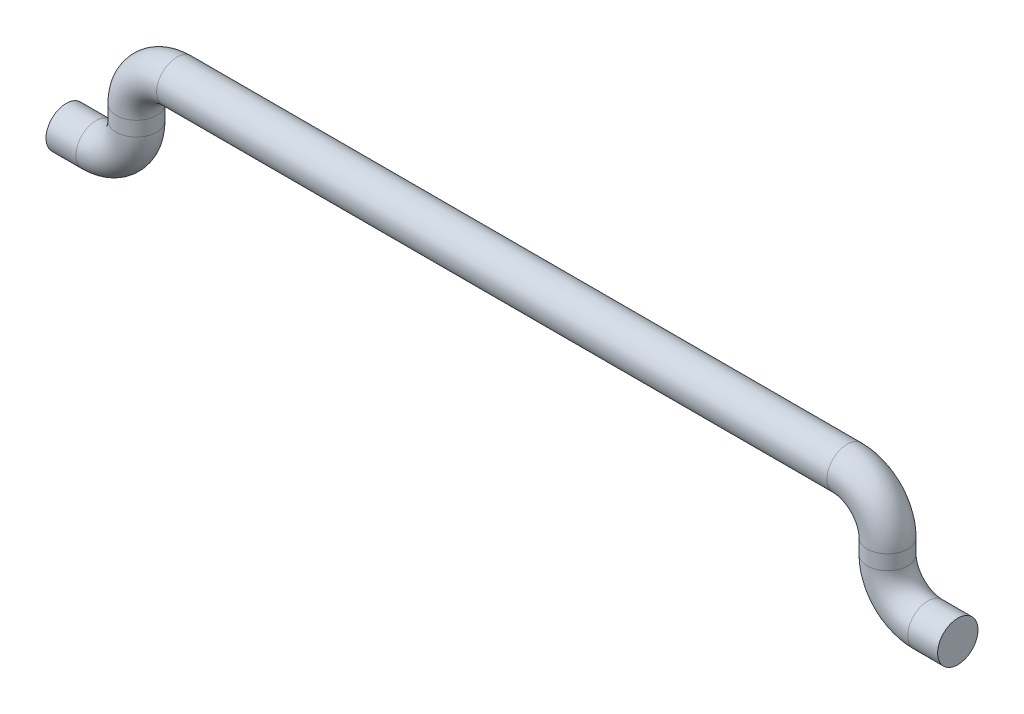
ISO-10303-21;
HEADER;
FILE_DESCRIPTION(('STEP AP214'),'2;1');
FILE_NAME('part.step','',(''),(''),'','','');
FILE_SCHEMA(('AUTOMOTIVE_DESIGN { 1 0 10303 214 1 1 1 1 }'));
ENDSEC;
DATA;
#1=APPLICATION_CONTEXT('core data for automotive mechanical design processes');
#2=APPLICATION_PROTOCOL_DEFINITION('international standard','automotive_design',2000,#1);
#3=PRODUCT_CONTEXT('',#1,'mechanical');
#4=PRODUCT('Part','Part','',(#3));
#5=PRODUCT_RELATED_PRODUCT_CATEGORY('part','',(#4));
#6=PRODUCT_DEFINITION_FORMATION('','',#4);
#7=PRODUCT_DEFINITION_CONTEXT('part definition',#1,'design');
#8=PRODUCT_DEFINITION('design','',#6,#7);
#9=PRODUCT_DEFINITION_SHAPE('','',#8);
#10=(LENGTH_UNIT() NAMED_UNIT(*) SI_UNIT(.MILLI.,.METRE.));
#11=(NAMED_UNIT(*) PLANE_ANGLE_UNIT() SI_UNIT($,.RADIAN.));
#12=(NAMED_UNIT(*) SI_UNIT($,.STERADIAN.) SOLID_ANGLE_UNIT());
#13=UNCERTAINTY_MEASURE_WITH_UNIT(LENGTH_MEASURE(1.E-05),#10,'distance_accuracy_value','');
#14=(GEOMETRIC_REPRESENTATION_CONTEXT(3) GLOBAL_UNCERTAINTY_ASSIGNED_CONTEXT((#13)) GLOBAL_UNIT_ASSIGNED_CONTEXT((#10,
#11,#12)) REPRESENTATION_CONTEXT('',''));
#15=CARTESIAN_POINT('',(0.,0.,0.));
#16=DIRECTION('',(0.,0.,1.));
#17=DIRECTION('',(1.,0.,0.));
#18=AXIS2_PLACEMENT_3D('',#15,#16,#17);
#19=CARTESIAN_POINT('',(27.6,-5.9,0.));
#20=DIRECTION('',(1.,0.,0.));
#21=DIRECTION('',(0.,0.,-1.));
#22=AXIS2_PLACEMENT_3D('',#19,#20,#21);
#23=PLANE('',#22);
#24=CARTESIAN_POINT('',(27.6,-5.9,0.));
#25=DIRECTION('',(1.,0.,0.));
#26=DIRECTION('',(0.,0.,-1.));
#27=AXIS2_PLACEMENT_3D('',#24,#25,#26);
#28=CIRCLE('',#27,1.25);
#29=CARTESIAN_POINT('',(27.6,-5.9,-1.25));
#30=VERTEX_POINT('',#29);
#31=EDGE_CURVE('E80',#30,#30,#28,.T.);
#32=ORIENTED_EDGE('',*,*,#31,.T.);
#33=EDGE_LOOP('',(#32));
#34=FACE_BOUND('',#33,.T.);
#35=ADVANCED_FACE('F37',(#34),#23,.T.);
#36=CARTESIAN_POINT('',(-27.6,-5.90000000000025,0.));
#37=DIRECTION('',(1.,0.,0.));
#38=DIRECTION('',(0.,0.,-1.));
#39=AXIS2_PLACEMENT_3D('',#36,#37,#38);
#40=PLANE('',#39);
#41=CARTESIAN_POINT('',(-27.6,-5.90000000000025,0.));
#42=DIRECTION('',(1.,0.,0.));
#43=DIRECTION('',(0.,0.,-1.));
#44=AXIS2_PLACEMENT_3D('',#41,#42,#43);
#45=CIRCLE('',#44,1.25);
#46=CARTESIAN_POINT('',(-27.6,-5.90000000000025,-1.25));
#47=VERTEX_POINT('',#46);
#48=EDGE_CURVE('E10',#47,#47,#45,.T.);
#49=ORIENTED_EDGE('',*,*,#48,.F.);
#50=EDGE_LOOP('',(#49));
#51=FACE_BOUND('',#50,.T.);
#52=ADVANCED_FACE('F89',(#51),#40,.F.);
#53=CARTESIAN_POINT('',(27.6,-5.9,0.));
#54=DIRECTION('',(-1.,0.,0.));
#55=DIRECTION('',(0.,-1.,0.));
#56=AXIS2_PLACEMENT_3D('',#53,#54,#55);
#57=CYLINDRICAL_SURFACE('',#56,1.25);
#58=CARTESIAN_POINT('',(25.75,-5.89999999999999,0.));
#59=DIRECTION('',(1.,0.,0.));
#60=DIRECTION('',(0.,0.,-1.));
#61=AXIS2_PLACEMENT_3D('',#58,#59,#60);
#62=CIRCLE('',#61,1.25);
#63=CARTESIAN_POINT('',(25.75,-7.15000000000022,0.));
#64=VERTEX_POINT('',#63);
#65=EDGE_CURVE('E76',#64,#64,#62,.T.);
#66=ORIENTED_EDGE('',*,*,#65,.T.);
#67=EDGE_LOOP('',(#66));
#68=FACE_BOUND('',#67,.T.);
#69=ORIENTED_EDGE('',*,*,#31,.F.);
#70=EDGE_LOOP('',(#69));
#71=FACE_BOUND('',#70,.T.);
#72=ADVANCED_FACE('F86',(#68,#71),#57,.T.);
#73=CARTESIAN_POINT('',(25.75,-3.39999999999998,0.));
#74=DIRECTION('',(0.,0.,-1.));
#75=DIRECTION('',(-1.,0.,0.));
#76=AXIS2_PLACEMENT_3D('',#73,#74,#75);
#77=TOROIDAL_SURFACE('',#76,2.50000000000023,1.25);
#78=CARTESIAN_POINT('',(23.25,-3.39999999999999,0.));
#79=DIRECTION('',(0.,-1.,0.));
#80=DIRECTION('',(0.,0.,-1.));
#81=AXIS2_PLACEMENT_3D('',#78,#79,#80);
#82=CIRCLE('',#81,1.25);
#83=CARTESIAN_POINT('',(21.9999999999998,-3.39999999999999,0.));
#84=VERTEX_POINT('',#83);
#85=EDGE_CURVE('E72',#84,#84,#82,.T.);
#86=CARTESIAN_POINT('',(25.75,-3.39999999999998,0.));
#87=DIRECTION('',(0.,0.,-1.));
#88=DIRECTION('',(-1.,0.,0.));
#89=AXIS2_PLACEMENT_3D('',#86,#87,#88);
#90=CIRCLE('',#89,3.75000000000023);
#91=EDGE_CURVE('',#64,#84,#90,.T.);
#92=ORIENTED_EDGE('',*,*,#65,.F.);
#93=ORIENTED_EDGE('',*,*,#85,.T.);
#94=ORIENTED_EDGE('',*,*,#91,.T.);
#95=ORIENTED_EDGE('',*,*,#91,.F.);
#96=EDGE_LOOP('',(#92,#94,#93,#95));
#97=FACE_BOUND('',#96,.T.);
#98=ADVANCED_FACE('F88',(#97),#77,.T.);
#99=CARTESIAN_POINT('',(23.25,-3.39999999999999,0.));
#100=DIRECTION('',(0.,1.,0.));
#101=DIRECTION('',(0.,0.,1.));
#102=AXIS2_PLACEMENT_3D('',#99,#100,#101);
#103=CYLINDRICAL_SURFACE('',#102,1.25);
#104=CARTESIAN_POINT('',(23.25,-2.49999999999999,0.));
#105=DIRECTION('',(0.,-1.,0.));
#106=DIRECTION('',(0.,0.,-1.));
#107=AXIS2_PLACEMENT_3D('',#104,#105,#106);
#108=CIRCLE('',#107,1.25);
#109=CARTESIAN_POINT('',(24.5,-2.49999999999999,0.));
#110=VERTEX_POINT('',#109);
#111=EDGE_CURVE('E68',#110,#110,#108,.T.);
#112=ORIENTED_EDGE('',*,*,#111,.T.);
#113=EDGE_LOOP('',(#112));
#114=FACE_BOUND('',#113,.T.);
#115=ORIENTED_EDGE('',*,*,#85,.F.);
#116=EDGE_LOOP('',(#115));
#117=FACE_BOUND('',#116,.T.);
#118=ADVANCED_FACE('F96',(#114,#117),#103,.T.);
#119=CARTESIAN_POINT('',(20.75,-2.49999999999999,0.));
#120=DIRECTION('',(0.,0.,1.));
#121=DIRECTION('',(1.,0.,0.));
#122=AXIS2_PLACEMENT_3D('',#119,#120,#121);
#123=TOROIDAL_SURFACE('',#122,2.5,1.25);
#124=CARTESIAN_POINT('',(20.75,-2.2811613709095E-13,0.));
#125=DIRECTION('',(1.,0.,0.));
#126=DIRECTION('',(0.,0.,-1.));
#127=AXIS2_PLACEMENT_3D('',#124,#125,#126);
#128=CIRCLE('',#127,1.25);
#129=CARTESIAN_POINT('',(20.7499999999999,1.25,0.));
#130=VERTEX_POINT('',#129);
#131=EDGE_CURVE('E64',#130,#130,#128,.T.);
#132=CARTESIAN_POINT('',(20.75,-2.49999999999999,0.));
#133=DIRECTION('',(0.,0.,1.));
#134=DIRECTION('',(1.,0.,0.));
#135=AXIS2_PLACEMENT_3D('',#132,#133,#134);
#136=CIRCLE('',#135,3.75);
#137=EDGE_CURVE('',#110,#130,#136,.T.);
#138=ORIENTED_EDGE('',*,*,#111,.F.);
#139=ORIENTED_EDGE('',*,*,#131,.T.);
#140=ORIENTED_EDGE('',*,*,#137,.T.);
#141=ORIENTED_EDGE('',*,*,#137,.F.);
#142=EDGE_LOOP('',(#138,#140,#139,#141));
#143=FACE_BOUND('',#142,.T.);
#144=ADVANCED_FACE('F121',(#143),#123,.T.);
#145=CARTESIAN_POINT('',(20.75,-2.35922392732846E-13,0.));
#146=DIRECTION('',(-1.,0.,0.));
#147=DIRECTION('',(0.,-1.,0.));
#148=AXIS2_PLACEMENT_3D('',#145,#146,#147);
#149=CYLINDRICAL_SURFACE('',#148,1.25);
#150=CARTESIAN_POINT('',(-20.7500000000001,-2.48932818802672E-13,0.));
#151=DIRECTION('',(1.,0.,0.));
#152=DIRECTION('',(0.,0.,-1.));
#153=AXIS2_PLACEMENT_3D('',#150,#151,#152);
#154=CIRCLE('',#153,1.25);
#155=CARTESIAN_POINT('',(-20.7500000000001,1.24999999999976,0.));
#156=VERTEX_POINT('',#155);
#157=EDGE_CURVE('E60',#156,#156,#154,.T.);
#158=ORIENTED_EDGE('',*,*,#157,.T.);
#159=EDGE_LOOP('',(#158));
#160=FACE_BOUND('',#159,.T.);
#161=ORIENTED_EDGE('',*,*,#131,.F.);
#162=EDGE_LOOP('',(#161));
#163=FACE_BOUND('',#162,.T.);
#164=ADVANCED_FACE('F117',(#160,#163),#149,.T.);
#165=CARTESIAN_POINT('',(-20.75,-2.50000000000001,0.));
#166=DIRECTION('',(0.,0.,1.));
#167=DIRECTION('',(1.,0.,0.));
#168=AXIS2_PLACEMENT_3D('',#165,#166,#167);
#169=TOROIDAL_SURFACE('',#168,2.49999999999977,1.25);
#170=CARTESIAN_POINT('',(-23.25,-2.50000000000001,0.));
#171=DIRECTION('',(0.,1.,0.));
#172=DIRECTION('',(0.,0.,-1.));
#173=AXIS2_PLACEMENT_3D('',#170,#171,#172);
#174=CIRCLE('',#173,1.25);
#175=CARTESIAN_POINT('',(-24.4999999999998,-2.50000000000001,0.));
#176=VERTEX_POINT('',#175);
#177=EDGE_CURVE('E54',#176,#176,#174,.T.);
#178=CARTESIAN_POINT('',(-20.75,-2.50000000000001,0.));
#179=DIRECTION('',(0.,0.,1.));
#180=DIRECTION('',(1.,0.,0.));
#181=AXIS2_PLACEMENT_3D('',#178,#179,#180);
#182=CIRCLE('',#181,3.74999999999977);
#183=EDGE_CURVE('',#156,#176,#182,.T.);
#184=ORIENTED_EDGE('',*,*,#157,.F.);
#185=ORIENTED_EDGE('',*,*,#177,.T.);
#186=ORIENTED_EDGE('',*,*,#183,.T.);
#187=ORIENTED_EDGE('',*,*,#183,.F.);
#188=EDGE_LOOP('',(#184,#186,#185,#187));
#189=FACE_BOUND('',#188,.T.);
#190=ADVANCED_FACE('F113',(#189),#169,.T.);
#191=CARTESIAN_POINT('',(-23.25,-2.50000000000001,0.));
#192=DIRECTION('',(0.,-1.,0.));
#193=DIRECTION('',(0.,0.,-1.));
#194=AXIS2_PLACEMENT_3D('',#191,#192,#193);
#195=CYLINDRICAL_SURFACE('',#194,1.25);
#196=CARTESIAN_POINT('',(-23.25,-3.4,0.));
#197=DIRECTION('',(0.,1.,0.));
#198=DIRECTION('',(0.,0.,-1.));
#199=AXIS2_PLACEMENT_3D('',#196,#197,#198);
#200=CIRCLE('',#199,1.25);
#201=CARTESIAN_POINT('',(-22.,-3.4,0.));
#202=VERTEX_POINT('',#201);
#203=EDGE_CURVE('E49',#202,#202,#200,.T.);
#204=ORIENTED_EDGE('',*,*,#203,.T.);
#205=EDGE_LOOP('',(#204));
#206=FACE_BOUND('',#205,.T.);
#207=ORIENTED_EDGE('',*,*,#177,.F.);
#208=EDGE_LOOP('',(#207));
#209=FACE_BOUND('',#208,.T.);
#210=ADVANCED_FACE('F107',(#206,#209),#195,.T.);
#211=CARTESIAN_POINT('',(-25.75,-3.4,0.));
#212=DIRECTION('',(0.,0.,-1.));
#213=DIRECTION('',(-1.,0.,0.));
#214=AXIS2_PLACEMENT_3D('',#211,#212,#213);
#215=TOROIDAL_SURFACE('',#214,2.5,1.25);
#216=CARTESIAN_POINT('',(-25.7500000000001,-5.90000000000031,0.));
#217=DIRECTION('',(1.,0.,0.));
#218=DIRECTION('',(0.,0.,-1.));
#219=AXIS2_PLACEMENT_3D('',#216,#217,#218);
#220=CIRCLE('',#219,1.25);
#221=CARTESIAN_POINT('',(-25.7500000000001,-7.15,0.));
#222=VERTEX_POINT('',#221);
#223=EDGE_CURVE('E44',#222,#222,#220,.T.);
#224=CARTESIAN_POINT('',(-25.75,-3.4,0.));
#225=DIRECTION('',(0.,0.,-1.));
#226=DIRECTION('',(-1.,0.,0.));
#227=AXIS2_PLACEMENT_3D('',#224,#225,#226);
#228=CIRCLE('',#227,3.75);
#229=EDGE_CURVE('',#202,#222,#228,.T.);
#230=ORIENTED_EDGE('',*,*,#203,.F.);
#231=ORIENTED_EDGE('',*,*,#223,.T.);
#232=ORIENTED_EDGE('',*,*,#229,.T.);
#233=ORIENTED_EDGE('',*,*,#229,.F.);
#234=EDGE_LOOP('',(#230,#232,#231,#233));
#235=FACE_BOUND('',#234,.T.);
#236=ADVANCED_FACE('F102',(#235),#215,.T.);
#237=CARTESIAN_POINT('',(-25.75,-5.90000000000025,0.));
#238=DIRECTION('',(-1.,0.,0.));
#239=DIRECTION('',(0.,-1.,0.));
#240=AXIS2_PLACEMENT_3D('',#237,#238,#239);
#241=CYLINDRICAL_SURFACE('',#240,1.25);
#242=ORIENTED_EDGE('',*,*,#48,.T.);
#243=EDGE_LOOP('',(#242));
#244=FACE_BOUND('',#243,.T.);
#245=ORIENTED_EDGE('',*,*,#223,.F.);
#246=EDGE_LOOP('',(#245));
#247=FACE_BOUND('',#246,.T.);
#248=ADVANCED_FACE('F100',(#244,#247),#241,.T.);
#249=CLOSED_SHELL('',(#35,#52,#72,#98,#118,#144,#164,#190,#210,#236,#248));
#250=MANIFOLD_SOLID_BREP('B2',#249);
#251=ADVANCED_BREP_SHAPE_REPRESENTATION('',(#18,#250),#14);
#252=SHAPE_DEFINITION_REPRESENTATION(#9,#251);
ENDSEC;
END-ISO-10303-21;
